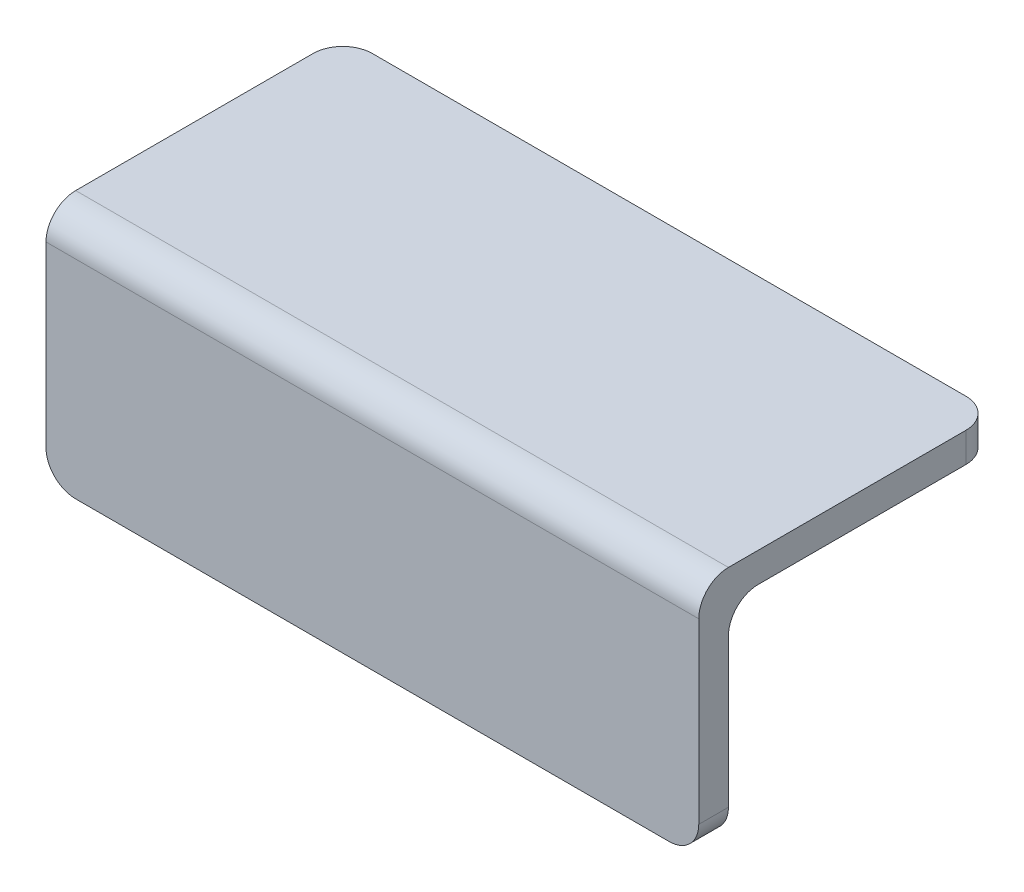
ISO-10303-21;
HEADER;
FILE_DESCRIPTION(('STEP AP214'),'2;1');
FILE_NAME('part.step','',(''),(''),'','','');
FILE_SCHEMA(('AUTOMOTIVE_DESIGN { 1 0 10303 214 1 1 1 1 }'));
ENDSEC;
DATA;
#1=APPLICATION_CONTEXT('core data for automotive mechanical design processes');
#2=APPLICATION_PROTOCOL_DEFINITION('international standard','automotive_design',2000,#1);
#3=PRODUCT_CONTEXT('',#1,'mechanical');
#4=PRODUCT('Part','Part','',(#3));
#5=PRODUCT_RELATED_PRODUCT_CATEGORY('part','',(#4));
#6=PRODUCT_DEFINITION_FORMATION('','',#4);
#7=PRODUCT_DEFINITION_CONTEXT('part definition',#1,'design');
#8=PRODUCT_DEFINITION('design','',#6,#7);
#9=PRODUCT_DEFINITION_SHAPE('','',#8);
#10=(LENGTH_UNIT() NAMED_UNIT(*) SI_UNIT(.MILLI.,.METRE.));
#11=(NAMED_UNIT(*) PLANE_ANGLE_UNIT() SI_UNIT($,.RADIAN.));
#12=(NAMED_UNIT(*) SI_UNIT($,.STERADIAN.) SOLID_ANGLE_UNIT());
#13=UNCERTAINTY_MEASURE_WITH_UNIT(LENGTH_MEASURE(1.E-05),#10,'distance_accuracy_value','');
#14=(GEOMETRIC_REPRESENTATION_CONTEXT(3) GLOBAL_UNCERTAINTY_ASSIGNED_CONTEXT((#13)) GLOBAL_UNIT_ASSIGNED_CONTEXT((#10,
#11,#12)) REPRESENTATION_CONTEXT('',''));
#15=CARTESIAN_POINT('',(0.,0.,0.));
#16=DIRECTION('',(0.,0.,1.));
#17=DIRECTION('',(1.,0.,0.));
#18=AXIS2_PLACEMENT_3D('',#15,#16,#17);
#19=CARTESIAN_POINT('',(18.499999359676,-9.350000651258,-1.7116019237));
#20=DIRECTION('',(0.,8.74227767236097E-08,-0.999999999999996));
#21=DIRECTION('',(0.,0.999999999999996,8.74227767236097E-08));
#22=AXIS2_PLACEMENT_3D('',#19,#20,#21);
#23=PLANE('',#22);
#24=CARTESIAN_POINT('',(17.499999352521,-9.95000063933306,-1.711601976153));
#25=DIRECTION('',(0.,-8.74227756084297E-08,0.999999999999996));
#26=DIRECTION('',(0.,-0.999999999999996,-8.74227756084297E-08));
#27=AXIS2_PLACEMENT_3D('',#24,#25,#26);
#28=CIRCLE('',#27,0.1);
#29=CARTESIAN_POINT('',(17.4999993519248,-10.0500006393291,-1.71160198489528));
#30=VERTEX_POINT('',#29);
#31=CARTESIAN_POINT('',(17.3999993525209,-9.95000063873653,-1.71160197615333));
#32=VERTEX_POINT('',#31);
#33=EDGE_CURVE('E110',#30,#32,#28,.F.);
#34=ORIENTED_EDGE('',*,*,#33,.T.);
#35=DIRECTION('',(0.,0.999999999999996,8.74227767236097E-08));
#36=VECTOR('',#35,1.);
#37=CARTESIAN_POINT('',(17.399999352521,-9.350000651258,-1.7116019237));
#38=LINE('',#37,#36);
#39=CARTESIAN_POINT('',(17.3999993555023,-9.45000063814,-1.71160193244214));
#40=VERTEX_POINT('',#39);
#41=EDGE_CURVE('E127',#32,#40,#38,.T.);
#42=ORIENTED_EDGE('',*,*,#41,.T.);
#43=DIRECTION('',(1.,-1.19248806385E-08,0.));
#44=VECTOR('',#43,1.);
#45=CARTESIAN_POINT('',(18.499999358484,-9.45000065125737,-1.711601932442));
#46=LINE('',#45,#44);
#47=CARTESIAN_POINT('',(19.599999358484,-9.45000065125737,-1.71160193244214));
#48=VERTEX_POINT('',#47);
#49=EDGE_CURVE('E122',#40,#48,#46,.T.);
#50=ORIENTED_EDGE('',*,*,#49,.T.);
#51=DIRECTION('',(0.,0.999999999999996,8.74227767236097E-08));
#52=VECTOR('',#51,1.);
#53=CARTESIAN_POINT('',(19.599999358484,-9.350000651258,-1.7116019237));
#54=LINE('',#53,#52);
#55=CARTESIAN_POINT('',(19.5999993569932,-9.95000066815003,-1.7116019761537));
#56=VERTEX_POINT('',#55);
#57=EDGE_CURVE('E111',#48,#56,#54,.F.);
#58=ORIENTED_EDGE('',*,*,#57,.T.);
#59=CARTESIAN_POINT('',(19.499999352521,-9.95000066318306,-1.71160197615372));
#60=DIRECTION('',(0.,8.74227756084297E-08,-0.999999999999996));
#61=DIRECTION('',(0.,0.999999999999996,8.74227756084297E-08));
#62=AXIS2_PLACEMENT_3D('',#59,#60,#61);
#63=CIRCLE('',#62,0.1);
#64=CARTESIAN_POINT('',(19.4999993513288,-10.0500006631749,-1.711601984896));
#65=VERTEX_POINT('',#64);
#66=EDGE_CURVE('E20',#56,#65,#63,.T.);
#67=ORIENTED_EDGE('',*,*,#66,.T.);
#68=DIRECTION('',(1.,-1.19248806384999E-08,0.));
#69=VECTOR('',#68,1.);
#70=CARTESIAN_POINT('',(18.499999351329,-10.05000065125,-1.711601984896));
#71=LINE('',#70,#69);
#72=EDGE_CURVE('E166',#30,#65,#71,.T.);
#73=ORIENTED_EDGE('',*,*,#72,.F.);
#74=EDGE_LOOP('',(#34,#42,#50,#58,#67,#73));
#75=FACE_BOUND('',#74,.T.);
#76=ADVANCED_FACE('F17',(#75),#23,.T.);
#77=CARTESIAN_POINT('',(18.499999358484,-9.450000642515,-1.811601932442));
#78=DIRECTION('',(1.,-1.19248806385E-08,0.));
#79=DIRECTION('',(1.19248806385E-08,1.,0.));
#80=AXIS2_PLACEMENT_3D('',#77,#78,#79);
#81=CYLINDRICAL_SURFACE('',#80,0.1);
#82=DIRECTION('',(1.,-1.19248806384999E-08,0.));
#83=VECTOR('',#82,1.);
#84=CARTESIAN_POINT('',(18.499999359676,-9.35000064251522,-1.8116019237));
#85=LINE('',#84,#83);
#86=CARTESIAN_POINT('',(19.5999993596762,-9.35000065563259,-1.81160192369986));
#87=VERTEX_POINT('',#86);
#88=CARTESIAN_POINT('',(17.399999359676,-9.35000062939785,-1.81160192369986));
#89=VERTEX_POINT('',#88);
#90=EDGE_CURVE('E178',#87,#89,#85,.F.);
#91=ORIENTED_EDGE('',*,*,#90,.F.);
#92=CARTESIAN_POINT('',(19.599999358484,-9.45000065563237,-1.811601932442));
#93=DIRECTION('',(1.,-1.19248806385E-08,0.));
#94=DIRECTION('',(1.19248806385E-08,1.,0.));
#95=AXIS2_PLACEMENT_3D('',#92,#93,#94);
#96=CIRCLE('',#95,0.1);
#97=EDGE_CURVE('E130',#48,#87,#96,.F.);
#98=ORIENTED_EDGE('',*,*,#97,.F.);
#99=ORIENTED_EDGE('',*,*,#49,.F.);
#100=CARTESIAN_POINT('',(17.3999993584835,-9.45000062939763,-1.811601932442));
#101=DIRECTION('',(1.,-1.19248806385E-08,0.));
#102=DIRECTION('',(1.19248806385E-08,1.,0.));
#103=AXIS2_PLACEMENT_3D('',#100,#101,#102);
#104=CIRCLE('',#103,0.1);
#105=EDGE_CURVE('E163',#89,#40,#104,.T.);
#106=ORIENTED_EDGE('',*,*,#105,.F.);
#107=EDGE_LOOP('',(#91,#98,#99,#106));
#108=FACE_BOUND('',#107,.T.);
#109=ADVANCED_FACE('F177',(#108),#81,.F.);
#110=CARTESIAN_POINT('',(18.499999351329,-10.05000065125,-1.711601984896));
#111=DIRECTION('',(-1.19248806385E-08,-0.999999999999996,-8.74227756084296E-08));
#112=DIRECTION('',(0.,8.74227756084297E-08,-0.999999999999996));
#113=AXIS2_PLACEMENT_3D('',#110,#111,#112);
#114=PLANE('',#113);
#115=DIRECTION('',(0.,8.74227756084297E-08,-0.999999999999996));
#116=VECTOR('',#115,1.);
#117=CARTESIAN_POINT('',(19.499999351329,-10.0500006631749,-1.711601984896));
#118=LINE('',#117,#116);
#119=CARTESIAN_POINT('',(19.499999351925,-10.0500006540318,-1.61160197178239));
#120=VERTEX_POINT('',#119);
#121=EDGE_CURVE('E105',#65,#120,#118,.F.);
#122=ORIENTED_EDGE('',*,*,#121,.T.);
#123=DIRECTION('',(1.,0.,0.));
#124=VECTOR('',#123,1.);
#125=CARTESIAN_POINT('',(18.499999351329,-10.05000064807,-1.611601984896));
#126=LINE('',#125,#124);
#127=CARTESIAN_POINT('',(17.499999352521,-10.0500006480727,-1.611601984896));
#128=VERTEX_POINT('',#127);
#129=EDGE_CURVE('E157',#128,#120,#126,.T.);
#130=ORIENTED_EDGE('',*,*,#129,.F.);
#131=DIRECTION('',(0.,-8.74227756084297E-08,0.999999999999996));
#132=VECTOR('',#131,1.);
#133=CARTESIAN_POINT('',(17.499999352521,-10.050000629498,-1.82410198489528));
#134=LINE('',#133,#132);
#135=EDGE_CURVE('E158',#30,#128,#134,.T.);
#136=ORIENTED_EDGE('',*,*,#135,.F.);
#137=ORIENTED_EDGE('',*,*,#72,.T.);
#138=EDGE_LOOP('',(#122,#130,#136,#137));
#139=FACE_BOUND('',#138,.T.);
#140=ADVANCED_FACE('F232',(#139),#114,.T.);
#141=CARTESIAN_POINT('',(18.499999359676,-9.350000572577,-2.6116019237));
#142=DIRECTION('',(-1.19248806385E-08,-0.999999999999996,-8.74227766107197E-08));
#143=DIRECTION('',(0.,8.74227766107197E-08,-0.999999999999996));
#144=AXIS2_PLACEMENT_3D('',#141,#142,#143);
#145=PLANE('',#144);
#146=CARTESIAN_POINT('',(19.4999993596761,-9.35000059324451,-2.51160192370022));
#147=DIRECTION('',(1.19248806385E-08,0.999999999999996,8.74227769962097E-08));
#148=DIRECTION('',(0.,-8.74227769962097E-08,0.999999999999996));
#149=AXIS2_PLACEMENT_3D('',#146,#147,#148);
#150=CIRCLE('',#149,0.1);
#151=CARTESIAN_POINT('',(19.5999993596759,-9.35000059443682,-2.51160192370011));
#152=VERTEX_POINT('',#151);
#153=CARTESIAN_POINT('',(19.4999993602725,-9.35000058450212,-2.61160192370025));
#154=VERTEX_POINT('',#153);
#155=EDGE_CURVE('E149',#152,#154,#150,.T.);
#156=ORIENTED_EDGE('',*,*,#155,.F.);
#157=DIRECTION('',(0.,8.74227766107197E-08,-0.999999999999996));
#158=VECTOR('',#157,1.);
#159=CARTESIAN_POINT('',(19.599999359676,-9.35000058569437,-2.6116019237));
#160=LINE('',#159,#158);
#161=EDGE_CURVE('E161',#152,#87,#160,.F.);
#162=ORIENTED_EDGE('',*,*,#161,.T.);
#163=ORIENTED_EDGE('',*,*,#90,.T.);
#164=DIRECTION('',(0.,8.74227766107197E-08,-0.999999999999996));
#165=VECTOR('',#164,1.);
#166=CARTESIAN_POINT('',(17.399999359676,-9.35000055945963,-2.6116019237));
#167=LINE('',#166,#165);
#168=CARTESIAN_POINT('',(17.3999993596759,-9.35000056820185,-2.51160191932911));
#169=VERTEX_POINT('',#168);
#170=EDGE_CURVE('E162',#89,#169,#167,.T.);
#171=ORIENTED_EDGE('',*,*,#170,.T.);
#172=CARTESIAN_POINT('',(17.4999993596761,-9.35000056939428,-2.51160192370022));
#173=DIRECTION('',(-1.19248806385E-08,-0.999999999999996,-8.74227769962097E-08));
#174=DIRECTION('',(0.,8.74227769962097E-08,-0.999999999999996));
#175=AXIS2_PLACEMENT_3D('',#172,#173,#174);
#176=CIRCLE('',#175,0.1);
#177=CARTESIAN_POINT('',(17.499999359676,-9.350000572577,-2.61160192370025));
#178=VERTEX_POINT('',#177);
#179=EDGE_CURVE('E159',#169,#178,#176,.T.);
#180=ORIENTED_EDGE('',*,*,#179,.T.);
#181=DIRECTION('',(1.,0.,0.));
#182=VECTOR('',#181,1.);
#183=CARTESIAN_POINT('',(18.499999360869,-9.350000584502,-2.61160192370028));
#184=LINE('',#183,#182);
#185=EDGE_CURVE('E148',#154,#178,#184,.F.);
#186=ORIENTED_EDGE('',*,*,#185,.F.);
#187=EDGE_LOOP('',(#156,#162,#163,#171,#180,#186));
#188=FACE_BOUND('',#187,.T.);
#189=ADVANCED_FACE('F186',(#188),#145,.T.);
#190=CARTESIAN_POINT('',(17.499999352521,-9.950000629498,-1.824101976153));
#191=DIRECTION('',(0.,-8.74227756084297E-08,0.999999999999996));
#192=DIRECTION('',(0.,-0.999999999999996,-8.74227756084297E-08));
#193=AXIS2_PLACEMENT_3D('',#190,#191,#192);
#194=CYLINDRICAL_SURFACE('',#193,0.1);
#195=ORIENTED_EDGE('',*,*,#33,.F.);
#196=ORIENTED_EDGE('',*,*,#135,.T.);
#197=CARTESIAN_POINT('',(17.499999352521,-9.95000064807534,-1.61160197615372));
#198=DIRECTION('',(0.,-8.74227756084297E-08,0.999999999999996));
#199=DIRECTION('',(0.,-0.999999999999996,-8.74227756084297E-08));
#200=AXIS2_PLACEMENT_3D('',#197,#198,#199);
#201=CIRCLE('',#200,0.1);
#202=CARTESIAN_POINT('',(17.3999993525208,-9.9500006425115,-1.61160197615336));
#203=VERTEX_POINT('',#202);
#204=EDGE_CURVE('E154',#203,#128,#201,.T.);
#205=ORIENTED_EDGE('',*,*,#204,.F.);
#206=DIRECTION('',(0.,0.,1.));
#207=VECTOR('',#206,1.);
#208=CARTESIAN_POINT('',(17.3999993525207,-9.95000063814,-1.936601934628));
#209=LINE('',#208,#207);
#210=EDGE_CURVE('E147',#32,#203,#209,.T.);
#211=ORIENTED_EDGE('',*,*,#210,.F.);
#212=EDGE_LOOP('',(#195,#196,#205,#211));
#213=FACE_BOUND('',#212,.T.);
#214=ADVANCED_FACE('F234',(#213),#194,.T.);
#215=CARTESIAN_POINT('',(18.499999351329,-10.05000066,-1.611601984896));
#216=DIRECTION('',(0.,-8.74227768737397E-08,0.999999999999996));
#217=DIRECTION('',(0.,-0.999999999999996,-8.74227768737397E-08));
#218=AXIS2_PLACEMENT_3D('',#215,#216,#217);
#219=PLANE('',#218);
#220=DIRECTION('',(-1.,1.19248806385E-08,0.));
#221=VECTOR('',#220,1.);
#222=CARTESIAN_POINT('',(18.499999359676,-9.35000066000037,-1.6116019237));
#223=LINE('',#222,#221);
#224=CARTESIAN_POINT('',(17.3999993596765,-9.35000064251182,-1.6116019499265));
#225=VERTEX_POINT('',#224);
#226=CARTESIAN_POINT('',(19.5999993560985,-9.35000067311737,-1.61160192370003));
#227=VERTEX_POINT('',#226);
#228=EDGE_CURVE('E118',#225,#227,#223,.F.);
#229=ORIENTED_EDGE('',*,*,#228,.F.);
#230=DIRECTION('',(-1.19248806385E-08,-1.,0.));
#231=VECTOR('',#230,1.);
#232=CARTESIAN_POINT('',(17.399999358185,-9.47500061847,-1.611601976153));
#233=LINE('',#232,#231);
#234=EDGE_CURVE('E197',#203,#225,#233,.F.);
#235=ORIENTED_EDGE('',*,*,#234,.F.);
#236=ORIENTED_EDGE('',*,*,#204,.T.);
#237=ORIENTED_EDGE('',*,*,#129,.T.);
#238=CARTESIAN_POINT('',(19.499999352521,-9.95000067192534,-1.6116019499265));
#239=DIRECTION('',(0.,8.74227756084297E-08,-0.999999999999996));
#240=DIRECTION('',(0.,0.999999999999996,8.74227756084297E-08));
#241=AXIS2_PLACEMENT_3D('',#238,#239,#240);
#242=CIRCLE('',#241,0.1);
#243=CARTESIAN_POINT('',(19.5999993525209,-9.95000067252117,-1.61160196304011));
#244=VERTEX_POINT('',#243);
#245=EDGE_CURVE('E152',#244,#120,#242,.T.);
#246=ORIENTED_EDGE('',*,*,#245,.F.);
#247=DIRECTION('',(0.,-0.999999999999996,-8.74227768737397E-08));
#248=VECTOR('',#247,1.);
#249=CARTESIAN_POINT('',(19.599999352521,-10.05000066,-1.611601984896));
#250=LINE('',#249,#248);
#251=EDGE_CURVE('E115',#244,#227,#250,.F.);
#252=ORIENTED_EDGE('',*,*,#251,.T.);
#253=EDGE_LOOP('',(#229,#235,#236,#237,#246,#252));
#254=FACE_BOUND('',#253,.T.);
#255=ADVANCED_FACE('F228',(#254),#219,.T.);
#256=CARTESIAN_POINT('',(19.499999352521,-9.950000653348,-1.824101976153));
#257=DIRECTION('',(0.,8.74227756084297E-08,-0.999999999999996));
#258=DIRECTION('',(0.,0.999999999999996,8.74227756084297E-08));
#259=AXIS2_PLACEMENT_3D('',#256,#257,#258);
#260=CYLINDRICAL_SURFACE('',#259,0.1);
#261=ORIENTED_EDGE('',*,*,#245,.T.);
#262=ORIENTED_EDGE('',*,*,#121,.F.);
#263=ORIENTED_EDGE('',*,*,#66,.F.);
#264=DIRECTION('',(0.,0.,1.));
#265=VECTOR('',#264,1.);
#266=CARTESIAN_POINT('',(19.5999993525207,-9.950000673117,-1.936601934628));
#267=LINE('',#266,#265);
#268=EDGE_CURVE('E104',#244,#56,#267,.F.);
#269=ORIENTED_EDGE('',*,*,#268,.F.);
#270=EDGE_LOOP('',(#261,#262,#263,#269));
#271=FACE_BOUND('',#270,.T.);
#272=ADVANCED_FACE('F103',(#271),#260,.T.);
#273=CARTESIAN_POINT('',(19.499999359527,-9.362500593244,-2.511601924793));
#274=DIRECTION('',(1.19248806385E-08,0.999999999999996,8.74227769962097E-08));
#275=DIRECTION('',(0.,-8.74227769962097E-08,0.999999999999996));
#276=AXIS2_PLACEMENT_3D('',#273,#274,#275);
#277=CYLINDRICAL_SURFACE('',#276,0.1);
#278=ORIENTED_EDGE('',*,*,#155,.T.);
#279=DIRECTION('',(0.,0.999999999999996,8.74227769962097E-08));
#280=VECTOR('',#279,1.);
#281=CARTESIAN_POINT('',(19.499999360869,-9.250000572577,-2.611601914958));
#282=LINE('',#281,#280);
#283=CARTESIAN_POINT('',(19.4999993608688,-9.25000058450205,-2.611601914958));
#284=VERTEX_POINT('',#283);
#285=EDGE_CURVE('E151',#284,#154,#282,.F.);
#286=ORIENTED_EDGE('',*,*,#285,.F.);
#287=CARTESIAN_POINT('',(19.4999993608685,-9.25000059324428,-2.51160191495794));
#288=DIRECTION('',(1.19248806385E-08,0.999999999999996,8.74227769962097E-08));
#289=DIRECTION('',(0.,-8.74227769962097E-08,0.999999999999996));
#290=AXIS2_PLACEMENT_3D('',#287,#288,#289);
#291=CIRCLE('',#290,0.1);
#292=CARTESIAN_POINT('',(19.5999993608688,-9.25000059443682,-2.51160191932897));
#293=VERTEX_POINT('',#292);
#294=EDGE_CURVE('E136',#293,#284,#291,.T.);
#295=ORIENTED_EDGE('',*,*,#294,.F.);
#296=DIRECTION('',(1.19248806385E-08,1.,0.));
#297=VECTOR('',#296,1.);
#298=CARTESIAN_POINT('',(19.599999358185,-9.475000644705,-2.5116019237));
#299=LINE('',#298,#297);
#300=EDGE_CURVE('E117',#152,#293,#299,.T.);
#301=ORIENTED_EDGE('',*,*,#300,.F.);
#302=EDGE_LOOP('',(#278,#286,#295,#301));
#303=FACE_BOUND('',#302,.T.);
#304=ADVANCED_FACE('F192',(#303),#277,.T.);
#305=CARTESIAN_POINT('',(18.499999360869,-9.250000572577,-2.611601914958));
#306=DIRECTION('',(0.,8.74227769962097E-08,-0.999999999999996));
#307=DIRECTION('',(0.,0.999999999999996,8.74227769962097E-08));
#308=AXIS2_PLACEMENT_3D('',#305,#306,#307);
#309=PLANE('',#308);
#310=DIRECTION('',(0.,0.999999999999996,8.74227769962097E-08));
#311=VECTOR('',#310,1.);
#312=CARTESIAN_POINT('',(17.499999359676,-9.250000572577,-2.611601914958));
#313=LINE('',#312,#311);
#314=CARTESIAN_POINT('',(17.4999993602723,-9.25000056065228,-2.611601914958));
#315=VERTEX_POINT('',#314);
#316=EDGE_CURVE('E144',#315,#178,#313,.F.);
#317=ORIENTED_EDGE('',*,*,#316,.F.);
#318=DIRECTION('',(1.,-1.19248806384999E-08,0.));
#319=VECTOR('',#318,1.);
#320=CARTESIAN_POINT('',(18.499999360869,-9.25000057257722,-2.611601914958));
#321=LINE('',#320,#319);
#322=EDGE_CURVE('E135',#284,#315,#321,.F.);
#323=ORIENTED_EDGE('',*,*,#322,.F.);
#324=ORIENTED_EDGE('',*,*,#285,.T.);
#325=ORIENTED_EDGE('',*,*,#185,.T.);
#326=EDGE_LOOP('',(#317,#323,#324,#325));
#327=FACE_BOUND('',#326,.T.);
#328=ADVANCED_FACE('F213',(#327),#309,.T.);
#329=CARTESIAN_POINT('',(17.499999359527,-9.362500569395,-2.511601924793));
#330=DIRECTION('',(-1.19248806385E-08,-0.999999999999996,-8.74227769962097E-08));
#331=DIRECTION('',(0.,8.74227769962097E-08,-0.999999999999996));
#332=AXIS2_PLACEMENT_3D('',#329,#330,#331);
#333=CYLINDRICAL_SURFACE('',#332,0.1);
#334=CARTESIAN_POINT('',(17.4999993608686,-9.25000056939449,-2.51160191495794));
#335=DIRECTION('',(-1.19248806385E-08,-0.999999999999996,-8.74227769962097E-08));
#336=DIRECTION('',(0.,8.74227769962097E-08,-0.999999999999996));
#337=AXIS2_PLACEMENT_3D('',#334,#335,#336);
#338=CIRCLE('',#337,0.1);
#339=CARTESIAN_POINT('',(17.3999993608685,-9.250000568202,-2.51160191495797));
#340=VERTEX_POINT('',#339);
#341=EDGE_CURVE('E131',#315,#340,#338,.F.);
#342=ORIENTED_EDGE('',*,*,#341,.F.);
#343=ORIENTED_EDGE('',*,*,#316,.T.);
#344=ORIENTED_EDGE('',*,*,#179,.F.);
#345=DIRECTION('',(-1.19248806385E-08,-1.,0.));
#346=VECTOR('',#345,1.);
#347=CARTESIAN_POINT('',(17.399999358185,-9.47500061847,-2.511601914958));
#348=LINE('',#347,#346);
#349=EDGE_CURVE('E143',#340,#169,#348,.T.);
#350=ORIENTED_EDGE('',*,*,#349,.F.);
#351=EDGE_LOOP('',(#342,#343,#344,#350));
#352=FACE_BOUND('',#351,.T.);
#353=ADVANCED_FACE('F216',(#352),#333,.T.);
#354=CARTESIAN_POINT('',(17.399999358185,-9.47500061847,-1.936601934628));
#355=DIRECTION('',(-1.,1.19248806385E-08,0.));
#356=DIRECTION('',(-1.19248806385E-08,-1.,0.));
#357=AXIS2_PLACEMENT_3D('',#354,#355,#356);
#358=PLANE('',#357);
#359=ORIENTED_EDGE('',*,*,#105,.T.);
#360=ORIENTED_EDGE('',*,*,#41,.F.);
#361=ORIENTED_EDGE('',*,*,#210,.T.);
#362=ORIENTED_EDGE('',*,*,#234,.T.);
#363=CARTESIAN_POINT('',(17.3999993596765,-9.35000063814063,-1.7116019237));
#364=DIRECTION('',(-1.,1.19248806385E-08,0.));
#365=DIRECTION('',(-1.19248806385E-08,-1.,0.));
#366=AXIS2_PLACEMENT_3D('',#363,#364,#365);
#367=CIRCLE('',#366,0.1);
#368=CARTESIAN_POINT('',(17.399999360869,-9.25000063814035,-1.71160191495786));
#369=VERTEX_POINT('',#368);
#370=EDGE_CURVE('E140',#369,#225,#367,.F.);
#371=ORIENTED_EDGE('',*,*,#370,.F.);
#372=DIRECTION('',(0.,-8.74227764451197E-08,0.999999999999996));
#373=VECTOR('',#372,1.);
#374=CARTESIAN_POINT('',(17.399999360869,-9.25000064688263,-1.611601914958));
#375=LINE('',#374,#373);
#376=EDGE_CURVE('E134',#340,#369,#375,.T.);
#377=ORIENTED_EDGE('',*,*,#376,.F.);
#378=ORIENTED_EDGE('',*,*,#349,.T.);
#379=ORIENTED_EDGE('',*,*,#170,.F.);
#380=EDGE_LOOP('',(#359,#360,#361,#362,#371,#377,#378,#379));
#381=FACE_BOUND('',#380,.T.);
#382=ADVANCED_FACE('F171',(#381),#358,.T.);
#383=CARTESIAN_POINT('',(18.499999359676,-9.350000651258,-1.7116019237));
#384=DIRECTION('',(-1.,1.19248806385E-08,0.));
#385=DIRECTION('',(-1.19248806385E-08,-1.,0.));
#386=AXIS2_PLACEMENT_3D('',#383,#384,#385);
#387=CYLINDRICAL_SURFACE('',#386,0.1);
#388=CARTESIAN_POINT('',(19.599999359676,-9.35000066437537,-1.7116019237));
#389=DIRECTION('',(-1.,1.19248806385E-08,0.));
#390=DIRECTION('',(-1.19248806385E-08,-1.,0.));
#391=AXIS2_PLACEMENT_3D('',#388,#389,#390);
#392=CIRCLE('',#391,0.1);
#393=CARTESIAN_POINT('',(19.5999993608687,-9.25000066437509,-1.71160191495786));
#394=VERTEX_POINT('',#393);
#395=EDGE_CURVE('E35',#394,#227,#392,.F.);
#396=ORIENTED_EDGE('',*,*,#395,.F.);
#397=DIRECTION('',(1.,-1.19248806384999E-08,0.));
#398=VECTOR('',#397,1.);
#399=CARTESIAN_POINT('',(18.499999360869,-9.25000065125772,-1.711601914958));
#400=LINE('',#399,#398);
#401=EDGE_CURVE('E26',#369,#394,#400,.T.);
#402=ORIENTED_EDGE('',*,*,#401,.F.);
#403=ORIENTED_EDGE('',*,*,#370,.T.);
#404=ORIENTED_EDGE('',*,*,#228,.T.);
#405=EDGE_LOOP('',(#396,#402,#403,#404));
#406=FACE_BOUND('',#405,.T.);
#407=ADVANCED_FACE('F224',(#406),#387,.T.);
#408=CARTESIAN_POINT('',(19.599999358185,-9.475000644705,-1.936601934628));
#409=DIRECTION('',(1.,-1.19248806385E-08,0.));
#410=DIRECTION('',(1.19248806385E-08,1.,0.));
#411=AXIS2_PLACEMENT_3D('',#408,#409,#410);
#412=PLANE('',#411);
#413=ORIENTED_EDGE('',*,*,#395,.T.);
#414=ORIENTED_EDGE('',*,*,#251,.F.);
#415=ORIENTED_EDGE('',*,*,#268,.T.);
#416=ORIENTED_EDGE('',*,*,#57,.F.);
#417=ORIENTED_EDGE('',*,*,#97,.T.);
#418=ORIENTED_EDGE('',*,*,#161,.F.);
#419=ORIENTED_EDGE('',*,*,#300,.T.);
#420=DIRECTION('',(0.,-8.74227764451197E-08,0.999999999999996));
#421=VECTOR('',#420,1.);
#422=CARTESIAN_POINT('',(19.599999360869,-9.25000067311737,-1.611601914958));
#423=LINE('',#422,#421);
#424=EDGE_CURVE('E11',#394,#293,#423,.F.);
#425=ORIENTED_EDGE('',*,*,#424,.F.);
#426=EDGE_LOOP('',(#413,#414,#415,#416,#417,#418,#419,#425));
#427=FACE_BOUND('',#426,.T.);
#428=ADVANCED_FACE('F113',(#427),#412,.T.);
#429=CARTESIAN_POINT('',(18.499999360869,-9.25000066,-1.611601914958));
#430=DIRECTION('',(1.19248806385E-08,0.999999999999996,8.74227764451196E-08));
#431=DIRECTION('',(0.,-8.74227764451197E-08,0.999999999999996));
#432=AXIS2_PLACEMENT_3D('',#429,#430,#431);
#433=PLANE('',#432);
#434=ORIENTED_EDGE('',*,*,#401,.T.);
#435=ORIENTED_EDGE('',*,*,#424,.T.);
#436=ORIENTED_EDGE('',*,*,#294,.T.);
#437=ORIENTED_EDGE('',*,*,#322,.T.);
#438=ORIENTED_EDGE('',*,*,#341,.T.);
#439=ORIENTED_EDGE('',*,*,#376,.T.);
#440=EDGE_LOOP('',(#434,#435,#436,#437,#438,#439));
#441=FACE_BOUND('',#440,.T.);
#442=ADVANCED_FACE('F222',(#441),#433,.T.);
#443=CLOSED_SHELL('',(#76,#109,#140,#189,#214,#255,#272,#304,#328,#353,#382,#407,#428,#442));
#444=MANIFOLD_SOLID_BREP('B1',#443);
#445=ADVANCED_BREP_SHAPE_REPRESENTATION('',(#18,#444),#14);
#446=SHAPE_DEFINITION_REPRESENTATION(#9,#445);
ENDSEC;
END-ISO-10303-21;
